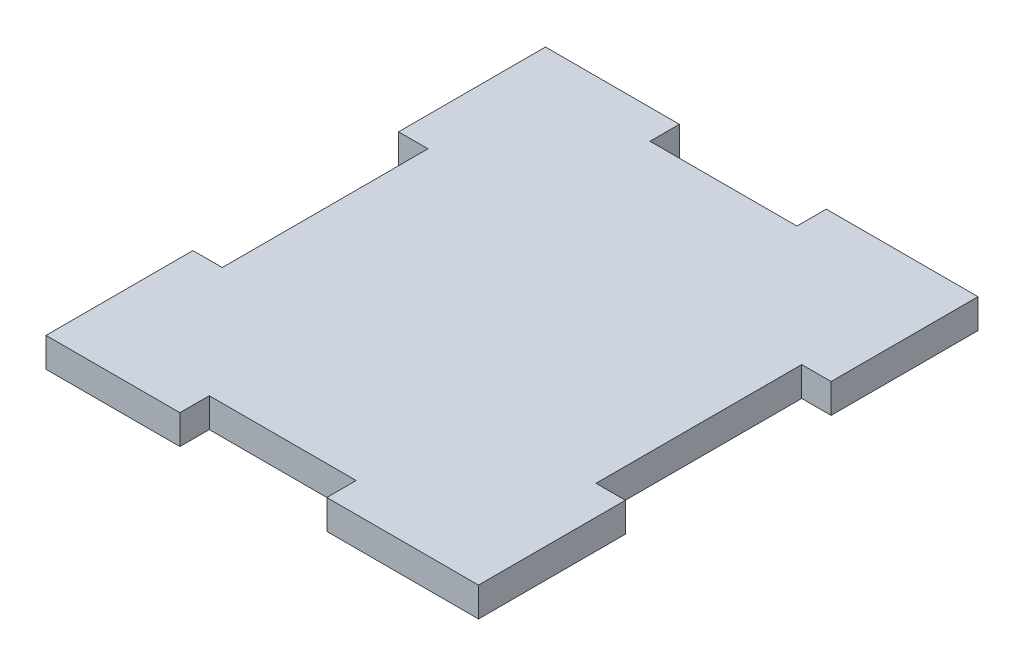
ISO-10303-21;
HEADER;
FILE_DESCRIPTION(('STEP AP214'),'2;1');
FILE_NAME('part.step','',(''),(''),'','','');
FILE_SCHEMA(('AUTOMOTIVE_DESIGN { 1 0 10303 214 1 1 1 1 }'));
ENDSEC;
DATA;
#1=APPLICATION_CONTEXT('core data for automotive mechanical design processes');
#2=APPLICATION_PROTOCOL_DEFINITION('international standard','automotive_design',2000,#1);
#3=PRODUCT_CONTEXT('',#1,'mechanical');
#4=PRODUCT('Part','Part','',(#3));
#5=PRODUCT_RELATED_PRODUCT_CATEGORY('part','',(#4));
#6=PRODUCT_DEFINITION_FORMATION('','',#4);
#7=PRODUCT_DEFINITION_CONTEXT('part definition',#1,'design');
#8=PRODUCT_DEFINITION('design','',#6,#7);
#9=PRODUCT_DEFINITION_SHAPE('','',#8);
#10=(LENGTH_UNIT() NAMED_UNIT(*) SI_UNIT(.MILLI.,.METRE.));
#11=(NAMED_UNIT(*) PLANE_ANGLE_UNIT() SI_UNIT($,.RADIAN.));
#12=(NAMED_UNIT(*) SI_UNIT($,.STERADIAN.) SOLID_ANGLE_UNIT());
#13=UNCERTAINTY_MEASURE_WITH_UNIT(LENGTH_MEASURE(1.E-05),#10,'distance_accuracy_value','');
#14=(GEOMETRIC_REPRESENTATION_CONTEXT(3) GLOBAL_UNCERTAINTY_ASSIGNED_CONTEXT((#13)) GLOBAL_UNIT_ASSIGNED_CONTEXT((#10,
#11,#12)) REPRESENTATION_CONTEXT('',''));
#15=CARTESIAN_POINT('',(0.,0.,0.));
#16=DIRECTION('',(0.,0.,1.));
#17=DIRECTION('',(1.,0.,0.));
#18=AXIS2_PLACEMENT_3D('',#15,#16,#17);
#19=CARTESIAN_POINT('',(0.,6.,-102.));
#20=DIRECTION('',(0.,0.,1.));
#21=DIRECTION('',(1.,0.,0.));
#22=AXIS2_PLACEMENT_3D('',#19,#20,#21);
#23=PLANE('',#22);
#24=DIRECTION('',(0.,-1.,0.));
#25=VECTOR('',#24,1.);
#26=CARTESIAN_POINT('',(21.34,0.,-102.));
#27=LINE('',#26,#25);
#28=CARTESIAN_POINT('',(21.34,6.,-102.));
#29=VERTEX_POINT('',#28);
#30=CARTESIAN_POINT('',(21.34,0.,-102.));
#31=VERTEX_POINT('',#30);
#32=EDGE_CURVE('E185',#29,#31,#27,.T.);
#33=ORIENTED_EDGE('',*,*,#32,.T.);
#34=DIRECTION('',(-1.,0.,0.));
#35=VECTOR('',#34,1.);
#36=CARTESIAN_POINT('',(0.,0.,-102.));
#37=LINE('',#36,#35);
#38=CARTESIAN_POINT('',(-6.,0.,-102.));
#39=VERTEX_POINT('',#38);
#40=EDGE_CURVE('E328',#31,#39,#37,.T.);
#41=ORIENTED_EDGE('',*,*,#40,.T.);
#42=DIRECTION('',(0.,-1.,0.));
#43=VECTOR('',#42,1.);
#44=CARTESIAN_POINT('',(-6.,0.,-102.));
#45=LINE('',#44,#43);
#46=CARTESIAN_POINT('',(-6.,6.,-102.));
#47=VERTEX_POINT('',#46);
#48=EDGE_CURVE('E255',#47,#39,#45,.T.);
#49=ORIENTED_EDGE('',*,*,#48,.F.);
#50=DIRECTION('',(-1.,0.,0.));
#51=VECTOR('',#50,1.);
#52=CARTESIAN_POINT('',(0.,6.,-102.));
#53=LINE('',#52,#51);
#54=EDGE_CURVE('E48',#29,#47,#53,.T.);
#55=ORIENTED_EDGE('',*,*,#54,.F.);
#56=EDGE_LOOP('',(#33,#41,#49,#55));
#57=FACE_BOUND('',#56,.T.);
#58=ADVANCED_FACE('F39',(#57),#23,.F.);
#59=DIRECTION('',(0.,1.,0.));
#60=VECTOR('',#59,1.);
#61=CARTESIAN_POINT('',(51.34,0.,-102.));
#62=LINE('',#61,#60);
#63=CARTESIAN_POINT('',(51.34,0.,-102.));
#64=VERTEX_POINT('',#63);
#65=CARTESIAN_POINT('',(51.34,6.,-102.));
#66=VERTEX_POINT('',#65);
#67=EDGE_CURVE('E196',#64,#66,#62,.T.);
#68=ORIENTED_EDGE('',*,*,#67,.T.);
#69=CARTESIAN_POINT('',(82.32,6.,-102.));
#70=VERTEX_POINT('',#69);
#71=EDGE_CURVE('E11',#70,#66,#53,.T.);
#72=ORIENTED_EDGE('',*,*,#71,.F.);
#73=DIRECTION('',(0.,1.,0.));
#74=VECTOR('',#73,1.);
#75=CARTESIAN_POINT('',(82.32,0.,-102.));
#76=LINE('',#75,#74);
#77=CARTESIAN_POINT('',(82.32,0.,-102.));
#78=VERTEX_POINT('',#77);
#79=EDGE_CURVE('E280',#78,#70,#76,.T.);
#80=ORIENTED_EDGE('',*,*,#79,.F.);
#81=EDGE_CURVE('E43',#78,#64,#37,.T.);
#82=ORIENTED_EDGE('',*,*,#81,.T.);
#83=EDGE_LOOP('',(#68,#72,#80,#82));
#84=FACE_BOUND('',#83,.T.);
#85=ADVANCED_FACE('F338',(#84),#23,.F.);
#86=CARTESIAN_POINT('',(0.,6.,0.));
#87=DIRECTION('',(0.,-1.,0.));
#88=DIRECTION('',(0.,0.,-1.));
#89=AXIS2_PLACEMENT_3D('',#86,#87,#88);
#90=PLANE('',#89);
#91=DIRECTION('',(0.,0.,-1.));
#92=VECTOR('',#91,1.);
#93=CARTESIAN_POINT('',(21.34,6.,-96.));
#94=LINE('',#93,#92);
#95=CARTESIAN_POINT('',(21.34,6.,-96.));
#96=VERTEX_POINT('',#95);
#97=EDGE_CURVE('E179',#96,#29,#94,.T.);
#98=ORIENTED_EDGE('',*,*,#97,.T.);
#99=ORIENTED_EDGE('',*,*,#54,.T.);
#100=DIRECTION('',(0.,0.,-1.));
#101=VECTOR('',#100,1.);
#102=CARTESIAN_POINT('',(-6.,6.,-102.));
#103=LINE('',#102,#101);
#104=CARTESIAN_POINT('',(-6.,6.,-72.));
#105=VERTEX_POINT('',#104);
#106=EDGE_CURVE('E262',#105,#47,#103,.T.);
#107=ORIENTED_EDGE('',*,*,#106,.F.);
#108=DIRECTION('',(1.,0.,0.));
#109=VECTOR('',#108,1.);
#110=CARTESIAN_POINT('',(-6.,6.,-72.));
#111=LINE('',#110,#109);
#112=CARTESIAN_POINT('',(0.,6.,-72.));
#113=VERTEX_POINT('',#112);
#114=EDGE_CURVE('E265',#105,#113,#111,.T.);
#115=ORIENTED_EDGE('',*,*,#114,.T.);
#116=DIRECTION('',(0.,0.,1.));
#117=VECTOR('',#116,1.);
#118=CARTESIAN_POINT('',(0.,6.,0.));
#119=LINE('',#118,#117);
#120=CARTESIAN_POINT('',(0.,6.,-30.));
#121=VERTEX_POINT('',#120);
#122=EDGE_CURVE('E313',#113,#121,#119,.T.);
#123=ORIENTED_EDGE('',*,*,#122,.T.);
#124=DIRECTION('',(1.,0.,0.));
#125=VECTOR('',#124,1.);
#126=CARTESIAN_POINT('',(-6.,6.,-30.));
#127=LINE('',#126,#125);
#128=CARTESIAN_POINT('',(-6.,6.,-30.));
#129=VERTEX_POINT('',#128);
#130=EDGE_CURVE('E246',#129,#121,#127,.T.);
#131=ORIENTED_EDGE('',*,*,#130,.F.);
#132=DIRECTION('',(0.,0.,-1.));
#133=VECTOR('',#132,1.);
#134=CARTESIAN_POINT('',(-6.,6.,-30.));
#135=LINE('',#134,#133);
#136=CARTESIAN_POINT('',(-6.,6.,0.));
#137=VERTEX_POINT('',#136);
#138=EDGE_CURVE('E244',#137,#129,#135,.T.);
#139=ORIENTED_EDGE('',*,*,#138,.F.);
#140=DIRECTION('',(1.,0.,0.));
#141=VECTOR('',#140,1.);
#142=CARTESIAN_POINT('',(0.,6.,0.));
#143=LINE('',#142,#141);
#144=CARTESIAN_POINT('',(21.34,6.,0.));
#145=VERTEX_POINT('',#144);
#146=EDGE_CURVE('E317',#137,#145,#143,.T.);
#147=ORIENTED_EDGE('',*,*,#146,.T.);
#148=DIRECTION('',(0.,0.,1.));
#149=VECTOR('',#148,1.);
#150=CARTESIAN_POINT('',(21.34,6.,-6.));
#151=LINE('',#150,#149);
#152=CARTESIAN_POINT('',(21.34,6.,-6.));
#153=VERTEX_POINT('',#152);
#154=EDGE_CURVE('E225',#153,#145,#151,.T.);
#155=ORIENTED_EDGE('',*,*,#154,.F.);
#156=DIRECTION('',(-1.,0.,0.));
#157=VECTOR('',#156,1.);
#158=CARTESIAN_POINT('',(21.34,6.,-6.));
#159=LINE('',#158,#157);
#160=CARTESIAN_POINT('',(51.34,6.,-6.));
#161=VERTEX_POINT('',#160);
#162=EDGE_CURVE('E220',#161,#153,#159,.T.);
#163=ORIENTED_EDGE('',*,*,#162,.F.);
#164=DIRECTION('',(0.,0.,1.));
#165=VECTOR('',#164,1.);
#166=CARTESIAN_POINT('',(51.34,6.,-6.));
#167=LINE('',#166,#165);
#168=CARTESIAN_POINT('',(51.34,6.,0.));
#169=VERTEX_POINT('',#168);
#170=EDGE_CURVE('E228',#161,#169,#167,.T.);
#171=ORIENTED_EDGE('',*,*,#170,.T.);
#172=CARTESIAN_POINT('',(82.32,6.,0.));
#173=VERTEX_POINT('',#172);
#174=EDGE_CURVE('E316',#169,#173,#143,.T.);
#175=ORIENTED_EDGE('',*,*,#174,.T.);
#176=DIRECTION('',(0.,0.,1.));
#177=VECTOR('',#176,1.);
#178=CARTESIAN_POINT('',(82.32,6.,0.));
#179=LINE('',#178,#177);
#180=CARTESIAN_POINT('',(82.32,6.,-30.));
#181=VERTEX_POINT('',#180);
#182=EDGE_CURVE('E301',#181,#173,#179,.T.);
#183=ORIENTED_EDGE('',*,*,#182,.F.);
#184=DIRECTION('',(-1.,0.,0.));
#185=VECTOR('',#184,1.);
#186=CARTESIAN_POINT('',(82.32,6.,-30.));
#187=LINE('',#186,#185);
#188=CARTESIAN_POINT('',(76.32,6.,-30.));
#189=VERTEX_POINT('',#188);
#190=EDGE_CURVE('E304',#181,#189,#187,.T.);
#191=ORIENTED_EDGE('',*,*,#190,.T.);
#192=DIRECTION('',(0.,0.,-1.));
#193=VECTOR('',#192,1.);
#194=CARTESIAN_POINT('',(76.32,6.,0.));
#195=LINE('',#194,#193);
#196=CARTESIAN_POINT('',(76.32,6.,-72.));
#197=VERTEX_POINT('',#196);
#198=EDGE_CURVE('E320',#189,#197,#195,.T.);
#199=ORIENTED_EDGE('',*,*,#198,.T.);
#200=DIRECTION('',(-1.,0.,0.));
#201=VECTOR('',#200,1.);
#202=CARTESIAN_POINT('',(82.32,6.,-72.));
#203=LINE('',#202,#201);
#204=CARTESIAN_POINT('',(82.32,6.,-72.));
#205=VERTEX_POINT('',#204);
#206=EDGE_CURVE('E285',#205,#197,#203,.T.);
#207=ORIENTED_EDGE('',*,*,#206,.F.);
#208=DIRECTION('',(0.,0.,1.));
#209=VECTOR('',#208,1.);
#210=CARTESIAN_POINT('',(82.32,6.,-72.));
#211=LINE('',#210,#209);
#212=EDGE_CURVE('E283',#70,#205,#211,.T.);
#213=ORIENTED_EDGE('',*,*,#212,.F.);
#214=ORIENTED_EDGE('',*,*,#71,.T.);
#215=DIRECTION('',(0.,0.,-1.));
#216=VECTOR('',#215,1.);
#217=CARTESIAN_POINT('',(51.34,6.,-96.));
#218=LINE('',#217,#216);
#219=CARTESIAN_POINT('',(51.34,6.,-96.));
#220=VERTEX_POINT('',#219);
#221=EDGE_CURVE('E189',#220,#66,#218,.T.);
#222=ORIENTED_EDGE('',*,*,#221,.F.);
#223=DIRECTION('',(-1.,0.,0.));
#224=VECTOR('',#223,1.);
#225=CARTESIAN_POINT('',(21.34,6.,-96.));
#226=LINE('',#225,#224);
#227=EDGE_CURVE('E193',#220,#96,#226,.T.);
#228=ORIENTED_EDGE('',*,*,#227,.T.);
#229=EDGE_LOOP('',(#98,#99,#107,#115,#123,#131,#139,#147,#155,#163,#171,#175,#183,#191,#199,
#207,#213,#214,#222,#228));
#230=FACE_BOUND('',#229,.T.);
#231=ADVANCED_FACE('F198',(#230),#90,.F.);
#232=CARTESIAN_POINT('',(0.,0.,0.));
#233=DIRECTION('',(0.,-1.,0.));
#234=DIRECTION('',(0.,0.,-1.));
#235=AXIS2_PLACEMENT_3D('',#232,#233,#234);
#236=PLANE('',#235);
#237=ORIENTED_EDGE('',*,*,#40,.F.);
#238=DIRECTION('',(0.,0.,-1.));
#239=VECTOR('',#238,1.);
#240=CARTESIAN_POINT('',(21.34,0.,-96.));
#241=LINE('',#240,#239);
#242=CARTESIAN_POINT('',(21.34,0.,-96.));
#243=VERTEX_POINT('',#242);
#244=EDGE_CURVE('E206',#243,#31,#241,.T.);
#245=ORIENTED_EDGE('',*,*,#244,.F.);
#246=DIRECTION('',(1.,0.,0.));
#247=VECTOR('',#246,1.);
#248=CARTESIAN_POINT('',(21.34,0.,-96.));
#249=LINE('',#248,#247);
#250=CARTESIAN_POINT('',(51.34,0.,-96.));
#251=VERTEX_POINT('',#250);
#252=EDGE_CURVE('E190',#243,#251,#249,.T.);
#253=ORIENTED_EDGE('',*,*,#252,.T.);
#254=DIRECTION('',(0.,0.,-1.));
#255=VECTOR('',#254,1.);
#256=CARTESIAN_POINT('',(51.34,0.,-96.));
#257=LINE('',#256,#255);
#258=EDGE_CURVE('E209',#251,#64,#257,.T.);
#259=ORIENTED_EDGE('',*,*,#258,.T.);
#260=ORIENTED_EDGE('',*,*,#81,.F.);
#261=DIRECTION('',(0.,0.,-1.));
#262=VECTOR('',#261,1.);
#263=CARTESIAN_POINT('',(82.32,0.,-72.));
#264=LINE('',#263,#262);
#265=CARTESIAN_POINT('',(82.32,0.,-72.));
#266=VERTEX_POINT('',#265);
#267=EDGE_CURVE('E277',#266,#78,#264,.T.);
#268=ORIENTED_EDGE('',*,*,#267,.F.);
#269=DIRECTION('',(-1.,0.,0.));
#270=VECTOR('',#269,1.);
#271=CARTESIAN_POINT('',(82.32,0.,-72.));
#272=LINE('',#271,#270);
#273=CARTESIAN_POINT('',(76.32,0.,-72.));
#274=VERTEX_POINT('',#273);
#275=EDGE_CURVE('E290',#266,#274,#272,.T.);
#276=ORIENTED_EDGE('',*,*,#275,.T.);
#277=DIRECTION('',(0.,0.,-1.));
#278=VECTOR('',#277,1.);
#279=CARTESIAN_POINT('',(76.32,0.,0.));
#280=LINE('',#279,#278);
#281=CARTESIAN_POINT('',(76.32,0.,-30.));
#282=VERTEX_POINT('',#281);
#283=EDGE_CURVE('E327',#282,#274,#280,.T.);
#284=ORIENTED_EDGE('',*,*,#283,.F.);
#285=DIRECTION('',(-1.,0.,0.));
#286=VECTOR('',#285,1.);
#287=CARTESIAN_POINT('',(82.32,0.,-30.));
#288=LINE('',#287,#286);
#289=CARTESIAN_POINT('',(82.32,0.,-30.));
#290=VERTEX_POINT('',#289);
#291=EDGE_CURVE('E309',#290,#282,#288,.T.);
#292=ORIENTED_EDGE('',*,*,#291,.F.);
#293=DIRECTION('',(0.,0.,-1.));
#294=VECTOR('',#293,1.);
#295=CARTESIAN_POINT('',(82.32,0.,0.));
#296=LINE('',#295,#294);
#297=CARTESIAN_POINT('',(82.32,0.,0.));
#298=VERTEX_POINT('',#297);
#299=EDGE_CURVE('E297',#298,#290,#296,.T.);
#300=ORIENTED_EDGE('',*,*,#299,.F.);
#301=DIRECTION('',(1.,0.,0.));
#302=VECTOR('',#301,1.);
#303=CARTESIAN_POINT('',(0.,0.,0.));
#304=LINE('',#303,#302);
#305=CARTESIAN_POINT('',(51.34,0.,0.));
#306=VERTEX_POINT('',#305);
#307=EDGE_CURVE('E324',#306,#298,#304,.T.);
#308=ORIENTED_EDGE('',*,*,#307,.F.);
#309=DIRECTION('',(0.,0.,1.));
#310=VECTOR('',#309,1.);
#311=CARTESIAN_POINT('',(51.34,0.,-6.));
#312=LINE('',#311,#310);
#313=CARTESIAN_POINT('',(51.34,0.,-6.));
#314=VERTEX_POINT('',#313);
#315=EDGE_CURVE('E231',#314,#306,#312,.T.);
#316=ORIENTED_EDGE('',*,*,#315,.F.);
#317=DIRECTION('',(1.,0.,0.));
#318=VECTOR('',#317,1.);
#319=CARTESIAN_POINT('',(21.34,0.,-6.));
#320=LINE('',#319,#318);
#321=CARTESIAN_POINT('',(21.34,0.,-6.));
#322=VERTEX_POINT('',#321);
#323=EDGE_CURVE('E214',#322,#314,#320,.T.);
#324=ORIENTED_EDGE('',*,*,#323,.F.);
#325=DIRECTION('',(0.,0.,1.));
#326=VECTOR('',#325,1.);
#327=CARTESIAN_POINT('',(21.34,0.,-6.));
#328=LINE('',#327,#326);
#329=CARTESIAN_POINT('',(21.34,0.,0.));
#330=VERTEX_POINT('',#329);
#331=EDGE_CURVE('E222',#322,#330,#328,.T.);
#332=ORIENTED_EDGE('',*,*,#331,.T.);
#333=CARTESIAN_POINT('',(-6.,0.,0.));
#334=VERTEX_POINT('',#333);
#335=EDGE_CURVE('E325',#334,#330,#304,.T.);
#336=ORIENTED_EDGE('',*,*,#335,.F.);
#337=DIRECTION('',(0.,0.,1.));
#338=VECTOR('',#337,1.);
#339=CARTESIAN_POINT('',(-6.,0.,-30.));
#340=LINE('',#339,#338);
#341=CARTESIAN_POINT('',(-6.,0.,-30.));
#342=VERTEX_POINT('',#341);
#343=EDGE_CURVE('E238',#342,#334,#340,.T.);
#344=ORIENTED_EDGE('',*,*,#343,.F.);
#345=DIRECTION('',(1.,0.,0.));
#346=VECTOR('',#345,1.);
#347=CARTESIAN_POINT('',(-6.,0.,-30.));
#348=LINE('',#347,#346);
#349=CARTESIAN_POINT('',(0.,0.,-30.));
#350=VERTEX_POINT('',#349);
#351=EDGE_CURVE('E251',#342,#350,#348,.T.);
#352=ORIENTED_EDGE('',*,*,#351,.T.);
#353=DIRECTION('',(0.,0.,1.));
#354=VECTOR('',#353,1.);
#355=CARTESIAN_POINT('',(0.,0.,0.));
#356=LINE('',#355,#354);
#357=CARTESIAN_POINT('',(0.,0.,-72.));
#358=VERTEX_POINT('',#357);
#359=EDGE_CURVE('E312',#358,#350,#356,.T.);
#360=ORIENTED_EDGE('',*,*,#359,.F.);
#361=DIRECTION('',(1.,0.,0.));
#362=VECTOR('',#361,1.);
#363=CARTESIAN_POINT('',(-6.,0.,-72.));
#364=LINE('',#363,#362);
#365=CARTESIAN_POINT('',(-6.,0.,-72.));
#366=VERTEX_POINT('',#365);
#367=EDGE_CURVE('E270',#366,#358,#364,.T.);
#368=ORIENTED_EDGE('',*,*,#367,.F.);
#369=DIRECTION('',(0.,0.,1.));
#370=VECTOR('',#369,1.);
#371=CARTESIAN_POINT('',(-6.,0.,-102.));
#372=LINE('',#371,#370);
#373=EDGE_CURVE('E258',#39,#366,#372,.T.);
#374=ORIENTED_EDGE('',*,*,#373,.F.);
#375=EDGE_LOOP('',(#237,#245,#253,#259,#260,#268,#276,#284,#292,#300,#308,#316,#324,#332,#336,
#344,#352,#360,#368,#374));
#376=FACE_BOUND('',#375,.T.);
#377=ADVANCED_FACE('F340',(#376),#236,.T.);
#378=CARTESIAN_POINT('',(0.,6.,0.));
#379=DIRECTION('',(0.,0.,-1.));
#380=DIRECTION('',(-1.,0.,0.));
#381=AXIS2_PLACEMENT_3D('',#378,#379,#380);
#382=PLANE('',#381);
#383=ORIENTED_EDGE('',*,*,#335,.T.);
#384=DIRECTION('',(0.,-1.,0.));
#385=VECTOR('',#384,1.);
#386=CARTESIAN_POINT('',(21.34,0.,0.));
#387=LINE('',#386,#385);
#388=EDGE_CURVE('E208',#145,#330,#387,.T.);
#389=ORIENTED_EDGE('',*,*,#388,.F.);
#390=ORIENTED_EDGE('',*,*,#146,.F.);
#391=DIRECTION('',(0.,1.,0.));
#392=VECTOR('',#391,1.);
#393=CARTESIAN_POINT('',(-6.,0.,0.));
#394=LINE('',#393,#392);
#395=EDGE_CURVE('E241',#334,#137,#394,.T.);
#396=ORIENTED_EDGE('',*,*,#395,.F.);
#397=EDGE_LOOP('',(#383,#389,#390,#396));
#398=FACE_BOUND('',#397,.T.);
#399=ADVANCED_FACE('F375',(#398),#382,.F.);
#400=CARTESIAN_POINT('',(0.,6.,0.));
#401=DIRECTION('',(1.,0.,0.));
#402=DIRECTION('',(0.,0.,-1.));
#403=AXIS2_PLACEMENT_3D('',#400,#401,#402);
#404=PLANE('',#403);
#405=DIRECTION('',(0.,-1.,0.));
#406=VECTOR('',#405,1.);
#407=CARTESIAN_POINT('',(0.,0.,-30.));
#408=LINE('',#407,#406);
#409=EDGE_CURVE('E227',#121,#350,#408,.T.);
#410=ORIENTED_EDGE('',*,*,#409,.F.);
#411=ORIENTED_EDGE('',*,*,#122,.F.);
#412=DIRECTION('',(0.,1.,0.));
#413=VECTOR('',#412,1.);
#414=CARTESIAN_POINT('',(0.,0.,-72.));
#415=LINE('',#414,#413);
#416=EDGE_CURVE('E254',#358,#113,#415,.T.);
#417=ORIENTED_EDGE('',*,*,#416,.F.);
#418=ORIENTED_EDGE('',*,*,#359,.T.);
#419=EDGE_LOOP('',(#410,#411,#417,#418));
#420=FACE_BOUND('',#419,.T.);
#421=ADVANCED_FACE('F41',(#420),#404,.F.);
#422=CARTESIAN_POINT('',(76.32,6.,0.));
#423=DIRECTION('',(-1.,0.,0.));
#424=DIRECTION('',(0.,0.,1.));
#425=AXIS2_PLACEMENT_3D('',#422,#423,#424);
#426=PLANE('',#425);
#427=DIRECTION('',(0.,-1.,0.));
#428=VECTOR('',#427,1.);
#429=CARTESIAN_POINT('',(76.32,0.,-72.));
#430=LINE('',#429,#428);
#431=EDGE_CURVE('E273',#197,#274,#430,.T.);
#432=ORIENTED_EDGE('',*,*,#431,.F.);
#433=ORIENTED_EDGE('',*,*,#198,.F.);
#434=DIRECTION('',(0.,1.,0.));
#435=VECTOR('',#434,1.);
#436=CARTESIAN_POINT('',(76.32,0.,-30.));
#437=LINE('',#436,#435);
#438=EDGE_CURVE('E293',#282,#189,#437,.T.);
#439=ORIENTED_EDGE('',*,*,#438,.F.);
#440=ORIENTED_EDGE('',*,*,#283,.T.);
#441=EDGE_LOOP('',(#432,#433,#439,#440));
#442=FACE_BOUND('',#441,.T.);
#443=ADVANCED_FACE('F403',(#442),#426,.F.);
#444=ORIENTED_EDGE('',*,*,#174,.F.);
#445=DIRECTION('',(0.,1.,0.));
#446=VECTOR('',#445,1.);
#447=CARTESIAN_POINT('',(51.34,0.,0.));
#448=LINE('',#447,#446);
#449=EDGE_CURVE('E215',#306,#169,#448,.T.);
#450=ORIENTED_EDGE('',*,*,#449,.F.);
#451=ORIENTED_EDGE('',*,*,#307,.T.);
#452=DIRECTION('',(0.,-1.,0.));
#453=VECTOR('',#452,1.);
#454=CARTESIAN_POINT('',(82.32,0.,0.));
#455=LINE('',#454,#453);
#456=EDGE_CURVE('E294',#173,#298,#455,.T.);
#457=ORIENTED_EDGE('',*,*,#456,.F.);
#458=EDGE_LOOP('',(#444,#450,#451,#457));
#459=FACE_BOUND('',#458,.T.);
#460=ADVANCED_FACE('F365',(#459),#382,.F.);
#461=CARTESIAN_POINT('',(82.32,0.,-30.));
#462=DIRECTION('',(0.,0.,1.));
#463=DIRECTION('',(1.,0.,0.));
#464=AXIS2_PLACEMENT_3D('',#461,#462,#463);
#465=PLANE('',#464);
#466=ORIENTED_EDGE('',*,*,#438,.T.);
#467=ORIENTED_EDGE('',*,*,#190,.F.);
#468=DIRECTION('',(0.,1.,0.));
#469=VECTOR('',#468,1.);
#470=CARTESIAN_POINT('',(82.32,0.,-30.));
#471=LINE('',#470,#469);
#472=EDGE_CURVE('E299',#290,#181,#471,.T.);
#473=ORIENTED_EDGE('',*,*,#472,.F.);
#474=ORIENTED_EDGE('',*,*,#291,.T.);
#475=EDGE_LOOP('',(#466,#467,#473,#474));
#476=FACE_BOUND('',#475,.T.);
#477=ADVANCED_FACE('F353',(#476),#465,.F.);
#478=CARTESIAN_POINT('',(82.32,0.,0.));
#479=DIRECTION('',(-1.,0.,0.));
#480=DIRECTION('',(0.,0.,1.));
#481=AXIS2_PLACEMENT_3D('',#478,#479,#480);
#482=PLANE('',#481);
#483=ORIENTED_EDGE('',*,*,#456,.T.);
#484=ORIENTED_EDGE('',*,*,#299,.T.);
#485=ORIENTED_EDGE('',*,*,#472,.T.);
#486=ORIENTED_EDGE('',*,*,#182,.T.);
#487=EDGE_LOOP('',(#483,#484,#485,#486));
#488=FACE_BOUND('',#487,.T.);
#489=ADVANCED_FACE('F357',(#488),#482,.F.);
#490=CARTESIAN_POINT('',(82.32,0.,-72.));
#491=DIRECTION('',(0.,0.,-1.));
#492=DIRECTION('',(-1.,0.,0.));
#493=AXIS2_PLACEMENT_3D('',#490,#491,#492);
#494=PLANE('',#493);
#495=ORIENTED_EDGE('',*,*,#431,.T.);
#496=ORIENTED_EDGE('',*,*,#275,.F.);
#497=DIRECTION('',(0.,-1.,0.));
#498=VECTOR('',#497,1.);
#499=CARTESIAN_POINT('',(82.32,0.,-72.));
#500=LINE('',#499,#498);
#501=EDGE_CURVE('E274',#205,#266,#500,.T.);
#502=ORIENTED_EDGE('',*,*,#501,.F.);
#503=ORIENTED_EDGE('',*,*,#206,.T.);
#504=EDGE_LOOP('',(#495,#496,#502,#503));
#505=FACE_BOUND('',#504,.T.);
#506=ADVANCED_FACE('F348',(#505),#494,.F.);
#507=CARTESIAN_POINT('',(82.32,0.,-72.));
#508=DIRECTION('',(-1.,0.,0.));
#509=DIRECTION('',(0.,0.,1.));
#510=AXIS2_PLACEMENT_3D('',#507,#508,#509);
#511=PLANE('',#510);
#512=ORIENTED_EDGE('',*,*,#501,.T.);
#513=ORIENTED_EDGE('',*,*,#267,.T.);
#514=ORIENTED_EDGE('',*,*,#79,.T.);
#515=ORIENTED_EDGE('',*,*,#212,.T.);
#516=EDGE_LOOP('',(#512,#513,#514,#515));
#517=FACE_BOUND('',#516,.T.);
#518=ADVANCED_FACE('F342',(#517),#511,.F.);
#519=CARTESIAN_POINT('',(-6.,0.,-72.));
#520=DIRECTION('',(0.,0.,-1.));
#521=DIRECTION('',(-1.,0.,0.));
#522=AXIS2_PLACEMENT_3D('',#519,#520,#521);
#523=PLANE('',#522);
#524=ORIENTED_EDGE('',*,*,#416,.T.);
#525=ORIENTED_EDGE('',*,*,#114,.F.);
#526=DIRECTION('',(0.,1.,0.));
#527=VECTOR('',#526,1.);
#528=CARTESIAN_POINT('',(-6.,0.,-72.));
#529=LINE('',#528,#527);
#530=EDGE_CURVE('E260',#366,#105,#529,.T.);
#531=ORIENTED_EDGE('',*,*,#530,.F.);
#532=ORIENTED_EDGE('',*,*,#367,.T.);
#533=EDGE_LOOP('',(#524,#525,#531,#532));
#534=FACE_BOUND('',#533,.T.);
#535=ADVANCED_FACE('F389',(#534),#523,.F.);
#536=CARTESIAN_POINT('',(-6.,0.,0.));
#537=DIRECTION('',(1.,0.,0.));
#538=DIRECTION('',(0.,0.,-1.));
#539=AXIS2_PLACEMENT_3D('',#536,#537,#538);
#540=PLANE('',#539);
#541=ORIENTED_EDGE('',*,*,#48,.T.);
#542=ORIENTED_EDGE('',*,*,#373,.T.);
#543=ORIENTED_EDGE('',*,*,#530,.T.);
#544=ORIENTED_EDGE('',*,*,#106,.T.);
#545=EDGE_LOOP('',(#541,#542,#543,#544));
#546=FACE_BOUND('',#545,.T.);
#547=ADVANCED_FACE('F393',(#546),#540,.F.);
#548=CARTESIAN_POINT('',(-6.,0.,-30.));
#549=DIRECTION('',(0.,0.,1.));
#550=DIRECTION('',(1.,0.,0.));
#551=AXIS2_PLACEMENT_3D('',#548,#549,#550);
#552=PLANE('',#551);
#553=ORIENTED_EDGE('',*,*,#409,.T.);
#554=ORIENTED_EDGE('',*,*,#351,.F.);
#555=DIRECTION('',(0.,-1.,0.));
#556=VECTOR('',#555,1.);
#557=CARTESIAN_POINT('',(-6.,0.,-30.));
#558=LINE('',#557,#556);
#559=EDGE_CURVE('E235',#129,#342,#558,.T.);
#560=ORIENTED_EDGE('',*,*,#559,.F.);
#561=ORIENTED_EDGE('',*,*,#130,.T.);
#562=EDGE_LOOP('',(#553,#554,#560,#561));
#563=FACE_BOUND('',#562,.T.);
#564=ADVANCED_FACE('F383',(#563),#552,.F.);
#565=CARTESIAN_POINT('',(-6.,0.,72.));
#566=DIRECTION('',(1.,0.,0.));
#567=DIRECTION('',(0.,0.,-1.));
#568=AXIS2_PLACEMENT_3D('',#565,#566,#567);
#569=PLANE('',#568);
#570=ORIENTED_EDGE('',*,*,#559,.T.);
#571=ORIENTED_EDGE('',*,*,#343,.T.);
#572=ORIENTED_EDGE('',*,*,#395,.T.);
#573=ORIENTED_EDGE('',*,*,#138,.T.);
#574=EDGE_LOOP('',(#570,#571,#572,#573));
#575=FACE_BOUND('',#574,.T.);
#576=ADVANCED_FACE('F378',(#575),#569,.F.);
#577=CARTESIAN_POINT('',(21.34,0.,-6.));
#578=DIRECTION('',(-1.,0.,0.));
#579=DIRECTION('',(0.,0.,1.));
#580=AXIS2_PLACEMENT_3D('',#577,#578,#579);
#581=PLANE('',#580);
#582=ORIENTED_EDGE('',*,*,#388,.T.);
#583=ORIENTED_EDGE('',*,*,#331,.F.);
#584=DIRECTION('',(0.,-1.,0.));
#585=VECTOR('',#584,1.);
#586=CARTESIAN_POINT('',(21.34,0.,-6.));
#587=LINE('',#586,#585);
#588=EDGE_CURVE('E64',#153,#322,#587,.T.);
#589=ORIENTED_EDGE('',*,*,#588,.F.);
#590=ORIENTED_EDGE('',*,*,#154,.T.);
#591=EDGE_LOOP('',(#582,#583,#589,#590));
#592=FACE_BOUND('',#591,.T.);
#593=ADVANCED_FACE('F435',(#592),#581,.F.);
#594=CARTESIAN_POINT('',(51.34,0.,-6.));
#595=DIRECTION('',(1.,0.,0.));
#596=DIRECTION('',(0.,0.,-1.));
#597=AXIS2_PLACEMENT_3D('',#594,#595,#596);
#598=PLANE('',#597);
#599=ORIENTED_EDGE('',*,*,#449,.T.);
#600=ORIENTED_EDGE('',*,*,#170,.F.);
#601=DIRECTION('',(0.,1.,0.));
#602=VECTOR('',#601,1.);
#603=CARTESIAN_POINT('',(51.34,0.,-6.));
#604=LINE('',#603,#602);
#605=EDGE_CURVE('E217',#314,#161,#604,.T.);
#606=ORIENTED_EDGE('',*,*,#605,.F.);
#607=ORIENTED_EDGE('',*,*,#315,.T.);
#608=EDGE_LOOP('',(#599,#600,#606,#607));
#609=FACE_BOUND('',#608,.T.);
#610=ADVANCED_FACE('F367',(#609),#598,.F.);
#611=CARTESIAN_POINT('',(0.,0.,-6.));
#612=DIRECTION('',(0.,0.,-1.));
#613=DIRECTION('',(-1.,0.,0.));
#614=AXIS2_PLACEMENT_3D('',#611,#612,#613);
#615=PLANE('',#614);
#616=ORIENTED_EDGE('',*,*,#588,.T.);
#617=ORIENTED_EDGE('',*,*,#323,.T.);
#618=ORIENTED_EDGE('',*,*,#605,.T.);
#619=ORIENTED_EDGE('',*,*,#162,.T.);
#620=EDGE_LOOP('',(#616,#617,#618,#619));
#621=FACE_BOUND('',#620,.T.);
#622=ADVANCED_FACE('F370',(#621),#615,.F.);
#623=CARTESIAN_POINT('',(21.34,0.,-96.));
#624=DIRECTION('',(1.,0.,0.));
#625=DIRECTION('',(0.,0.,-1.));
#626=AXIS2_PLACEMENT_3D('',#623,#624,#625);
#627=PLANE('',#626);
#628=ORIENTED_EDGE('',*,*,#32,.F.);
#629=ORIENTED_EDGE('',*,*,#97,.F.);
#630=DIRECTION('',(0.,-1.,0.));
#631=VECTOR('',#630,1.);
#632=CARTESIAN_POINT('',(21.34,0.,-96.));
#633=LINE('',#632,#631);
#634=EDGE_CURVE('E182',#96,#243,#633,.T.);
#635=ORIENTED_EDGE('',*,*,#634,.T.);
#636=ORIENTED_EDGE('',*,*,#244,.T.);
#637=EDGE_LOOP('',(#628,#629,#635,#636));
#638=FACE_BOUND('',#637,.T.);
#639=ADVANCED_FACE('F181',(#638),#627,.T.);
#640=CARTESIAN_POINT('',(51.34,0.,-96.));
#641=DIRECTION('',(-1.,0.,0.));
#642=DIRECTION('',(0.,0.,1.));
#643=AXIS2_PLACEMENT_3D('',#640,#641,#642);
#644=PLANE('',#643);
#645=ORIENTED_EDGE('',*,*,#67,.F.);
#646=ORIENTED_EDGE('',*,*,#258,.F.);
#647=DIRECTION('',(0.,1.,0.));
#648=VECTOR('',#647,1.);
#649=CARTESIAN_POINT('',(51.34,0.,-96.));
#650=LINE('',#649,#648);
#651=EDGE_CURVE('E56',#251,#220,#650,.T.);
#652=ORIENTED_EDGE('',*,*,#651,.T.);
#653=ORIENTED_EDGE('',*,*,#221,.T.);
#654=EDGE_LOOP('',(#645,#646,#652,#653));
#655=FACE_BOUND('',#654,.T.);
#656=ADVANCED_FACE('F444',(#655),#644,.T.);
#657=CARTESIAN_POINT('',(0.,0.,-96.));
#658=DIRECTION('',(0.,0.,1.));
#659=DIRECTION('',(-1.,0.,0.));
#660=AXIS2_PLACEMENT_3D('',#657,#658,#659);
#661=PLANE('',#660);
#662=ORIENTED_EDGE('',*,*,#634,.F.);
#663=ORIENTED_EDGE('',*,*,#227,.F.);
#664=ORIENTED_EDGE('',*,*,#651,.F.);
#665=ORIENTED_EDGE('',*,*,#252,.F.);
#666=EDGE_LOOP('',(#662,#663,#664,#665));
#667=FACE_BOUND('',#666,.T.);
#668=ADVANCED_FACE('F192',(#667),#661,.F.);
#669=CLOSED_SHELL('',(#58,#85,#231,#377,#399,#421,#443,#460,#477,#489,#506,#518,#535,#547,#564,
#576,#593,#610,#622,#639,#656,#668));
#670=MANIFOLD_SOLID_BREP('B2',#669);
#671=ADVANCED_BREP_SHAPE_REPRESENTATION('',(#18,#670),#14);
#672=SHAPE_DEFINITION_REPRESENTATION(#9,#671);
ENDSEC;
END-ISO-10303-21;
